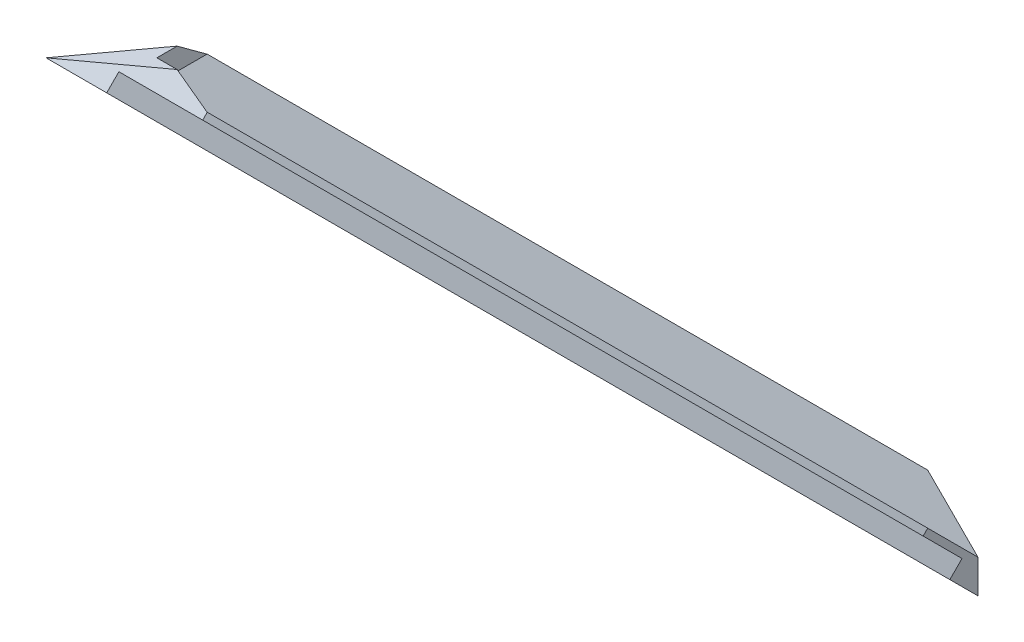
ISO-10303-21;
HEADER;
FILE_DESCRIPTION(('STEP AP214'),'2;1');
FILE_NAME('part.step','',(''),(''),'','','');
FILE_SCHEMA(('AUTOMOTIVE_DESIGN { 1 0 10303 214 1 1 1 1 }'));
ENDSEC;
DATA;
#1=APPLICATION_CONTEXT('core data for automotive mechanical design processes');
#2=APPLICATION_PROTOCOL_DEFINITION('international standard','automotive_design',2000,#1);
#3=PRODUCT_CONTEXT('',#1,'mechanical');
#4=PRODUCT('Part','Part','',(#3));
#5=PRODUCT_RELATED_PRODUCT_CATEGORY('part','',(#4));
#6=PRODUCT_DEFINITION_FORMATION('','',#4);
#7=PRODUCT_DEFINITION_CONTEXT('part definition',#1,'design');
#8=PRODUCT_DEFINITION('design','',#6,#7);
#9=PRODUCT_DEFINITION_SHAPE('','',#8);
#10=(LENGTH_UNIT() NAMED_UNIT(*) SI_UNIT(.MILLI.,.METRE.));
#11=(NAMED_UNIT(*) PLANE_ANGLE_UNIT() SI_UNIT($,.RADIAN.));
#12=(NAMED_UNIT(*) SI_UNIT($,.STERADIAN.) SOLID_ANGLE_UNIT());
#13=UNCERTAINTY_MEASURE_WITH_UNIT(LENGTH_MEASURE(1.E-05),#10,'distance_accuracy_value','');
#14=(GEOMETRIC_REPRESENTATION_CONTEXT(3) GLOBAL_UNCERTAINTY_ASSIGNED_CONTEXT((#13)) GLOBAL_UNIT_ASSIGNED_CONTEXT((#10,
#11,#12)) REPRESENTATION_CONTEXT('',''));
#15=CARTESIAN_POINT('',(0.,0.,0.));
#16=DIRECTION('',(0.,0.,1.));
#17=DIRECTION('',(1.,0.,0.));
#18=AXIS2_PLACEMENT_3D('',#15,#16,#17);
#19=CARTESIAN_POINT('',(-2.22799097931636E-11,6.68963210030669E-12,81.065646874061));
#20=DIRECTION('',(0.,0.,1.));
#21=DIRECTION('',(1.,0.,0.));
#22=AXIS2_PLACEMENT_3D('',#19,#20,#21);
#23=PLANE('',#22);
#24=DIRECTION('',(-0.707106781186531,0.707106781186564,0.));
#25=VECTOR('',#24,1.);
#26=CARTESIAN_POINT('',(-78.9443265304896,-78.9443265304859,81.065646874061));
#27=LINE('',#26,#25);
#28=CARTESIAN_POINT('',(-83.8433060160558,-74.0453470449194,81.0656468740416));
#29=VERTEX_POINT('',#28);
#30=CARTESIAN_POINT('',(-90.6100214304942,-67.2786316304808,81.0656468740416));
#31=VERTEX_POINT('',#30);
#32=EDGE_CURVE('E218',#29,#31,#27,.T.);
#33=ORIENTED_EDGE('',*,*,#32,.T.);
#34=DIRECTION('',(-0.707106781186564,-0.707106781186531,0.));
#35=VECTOR('',#34,1.);
#36=CARTESIAN_POINT('',(-87.2424253850932,-63.9110355850799,81.0656468740418));
#37=LINE('',#36,#35);
#38=CARTESIAN_POINT('',(-89.8162713626101,-66.484881562597,81.0656468740418));
#39=VERTEX_POINT('',#38);
#40=EDGE_CURVE('E209',#39,#31,#37,.T.);
#41=ORIENTED_EDGE('',*,*,#40,.F.);
#42=DIRECTION('',(-0.707106781186548,0.707106781186547,0.));
#43=VECTOR('',#42,1.);
#44=CARTESIAN_POINT('',(-156.301152925207,0.,81.065646874061));
#45=LINE('',#44,#43);
#46=CARTESIAN_POINT('',(-81.065646874061,-75.235506051146,81.065646874061));
#47=VERTEX_POINT('',#46);
#48=EDGE_CURVE('E61',#47,#39,#45,.T.);
#49=ORIENTED_EDGE('',*,*,#48,.F.);
#50=DIRECTION('',(0.,1.,0.));
#51=VECTOR('',#50,1.);
#52=CARTESIAN_POINT('',(-81.0656468740447,7.36469543671736E-12,81.065646874061));
#53=LINE('',#52,#51);
#54=CARTESIAN_POINT('',(-81.0656468740454,-81.0656468740454,81.0656468740454));
#55=VERTEX_POINT('',#54);
#56=EDGE_CURVE('E11',#55,#47,#53,.T.);
#57=ORIENTED_EDGE('',*,*,#56,.F.);
#58=DIRECTION('',(-0.707106781186547,0.707106781186548,0.));
#59=VECTOR('',#58,1.);
#60=CARTESIAN_POINT('',(-162.131293748091,0.,81.065646874061));
#61=LINE('',#60,#59);
#62=CARTESIAN_POINT('',(-85.9646263596136,-76.1666673884772,81.0656468740415));
#63=VERTEX_POINT('',#62);
#64=EDGE_CURVE('E222',#55,#63,#61,.T.);
#65=ORIENTED_EDGE('',*,*,#64,.T.);
#66=DIRECTION('',(-0.707106781186564,-0.707106781186531,0.));
#67=VECTOR('',#66,1.);
#68=CARTESIAN_POINT('',(-83.8433060160558,-74.0453470449194,81.0656468740416));
#69=LINE('',#68,#67);
#70=EDGE_CURVE('E233',#29,#63,#69,.T.);
#71=ORIENTED_EDGE('',*,*,#70,.F.);
#72=EDGE_LOOP('',(#33,#41,#49,#57,#65,#71));
#73=FACE_BOUND('',#72,.T.);
#74=ADVANCED_FACE('F36',(#73),#23,.F.);
#75=CARTESIAN_POINT('',(12.5408992154775,17.1311869146428,17.1311869146428));
#76=DIRECTION('',(-0.459700843380978,-0.627963030199556,-0.627963030199556));
#77=DIRECTION('',(0.,0.707106781186548,-0.707106781186547));
#78=AXIS2_PLACEMENT_3D('',#75,#76,#77);
#79=PLANE('',#78);
#80=DIRECTION('',(0.888073833977118,-0.325057583671865,-0.325057583671865));
#81=VECTOR('',#80,1.);
#82=CARTESIAN_POINT('',(93.606546089524,-93.6065460895218,68.524747658569));
#83=LINE('',#82,#81);
#84=CARTESIAN_POINT('',(-162.131293748091,0.,162.131293748091));
#85=VERTEX_POINT('',#84);
#86=CARTESIAN_POINT('',(-154.403887137778,-2.82842712474623,159.302866623345));
#87=VERTEX_POINT('',#86);
#88=EDGE_CURVE('E242',#85,#87,#83,.T.);
#89=ORIENTED_EDGE('',*,*,#88,.T.);
#90=DIRECTION('',(0.,-0.707106781186547,0.707106781186548));
#91=VECTOR('',#90,1.);
#92=CARTESIAN_POINT('',(-154.403887137778,-0.707106781186718,157.181546279785));
#93=LINE('',#92,#91);
#94=CARTESIAN_POINT('',(-154.403887137778,-0.707106781186718,157.181546279785));
#95=VERTEX_POINT('',#94);
#96=EDGE_CURVE('E142',#95,#87,#93,.T.);
#97=ORIENTED_EDGE('',*,*,#96,.F.);
#98=DIRECTION('',(0.888073833977118,-0.325057583671864,-0.325057583671865));
#99=VECTOR('',#98,1.);
#100=CARTESIAN_POINT('',(12.5408992154776,-61.813139615843,96.0755134451285));
#101=LINE('',#100,#99);
#102=CARTESIAN_POINT('',(-143.730406757284,-4.61387174724231,153.27478131373));
#103=VERTEX_POINT('',#102);
#104=EDGE_CURVE('E137',#95,#103,#101,.T.);
#105=ORIENTED_EDGE('',*,*,#104,.T.);
#106=DIRECTION('',(0.,-0.707106781186547,0.707106781186548));
#107=VECTOR('',#106,1.);
#108=CARTESIAN_POINT('',(-143.730406757284,-1.24627570184138,149.907185268329));
#109=LINE('',#108,#107);
#110=CARTESIAN_POINT('',(-143.730406757284,-3.82012167935991,152.481031245847));
#111=VERTEX_POINT('',#110);
#112=EDGE_CURVE('E141',#111,#103,#109,.T.);
#113=ORIENTED_EDGE('',*,*,#112,.F.);
#114=DIRECTION('',(0.888073833977118,-0.325057583671865,-0.325057583671865));
#115=VECTOR('',#114,1.);
#116=CARTESIAN_POINT('',(90.691475678082,-89.6244858536718,66.6766670715352));
#117=LINE('',#116,#115);
#118=CARTESIAN_POINT('',(-143.758059699553,-3.81000000000011,152.491152925207));
#119=VERTEX_POINT('',#118);
#120=EDGE_CURVE('E152',#119,#111,#117,.T.);
#121=ORIENTED_EDGE('',*,*,#120,.F.);
#122=DIRECTION('',(0.806898221355077,-0.590690494568867,0.));
#123=VECTOR('',#122,1.);
#124=CARTESIAN_POINT('',(-78.5785752817125,-51.5246942050026,152.491152925207));
#125=LINE('',#124,#123);
#126=CARTESIAN_POINT('',(-148.962616487972,0.,152.491152925207));
#127=VERTEX_POINT('',#126);
#128=EDGE_CURVE('E227',#127,#119,#125,.T.);
#129=ORIENTED_EDGE('',*,*,#128,.F.);
#130=DIRECTION('',(-0.806898221355077,0.,0.590690494568867));
#131=VECTOR('',#130,1.);
#132=CARTESIAN_POINT('',(20.7060873158624,0.,28.2850412864472));
#133=LINE('',#132,#131);
#134=EDGE_CURVE('E193',#127,#85,#133,.T.);
#135=ORIENTED_EDGE('',*,*,#134,.T.);
#136=EDGE_LOOP('',(#89,#97,#105,#113,#121,#129,#135));
#137=FACE_BOUND('',#136,.T.);
#138=ADVANCED_FACE('F253',(#137),#79,.F.);
#139=CARTESIAN_POINT('',(-81.0656468740454,6.75063336410865E-13,6.75063336410865E-13));
#140=DIRECTION('',(1.,0.,0.));
#141=DIRECTION('',(0.,1.,0.));
#142=AXIS2_PLACEMENT_3D('',#139,#140,#141);
#143=PLANE('',#142);
#144=DIRECTION('',(0.,0.707106781186548,0.707106781186547));
#145=VECTOR('',#144,1.);
#146=CARTESIAN_POINT('',(-81.065646874044,2.02519000923258E-12,162.131293748093));
#147=LINE('',#146,#145);
#148=CARTESIAN_POINT('',(-81.0656468740452,-76.1666673884791,85.9646263596118));
#149=VERTEX_POINT('',#148);
#150=EDGE_CURVE('E153',#55,#149,#147,.T.);
#151=ORIENTED_EDGE('',*,*,#150,.F.);
#152=ORIENTED_EDGE('',*,*,#56,.T.);
#153=DIRECTION('',(0.,0.707106781186547,0.707106781186548));
#154=VECTOR('',#153,1.);
#155=CARTESIAN_POINT('',(-81.0656468740441,1.97664029098071E-12,156.301152925209));
#156=LINE('',#155,#154);
#157=CARTESIAN_POINT('',(-81.0656468740452,-66.4848815625986,89.8162713626084));
#158=VERTEX_POINT('',#157);
#159=EDGE_CURVE('E166',#47,#158,#156,.T.);
#160=ORIENTED_EDGE('',*,*,#159,.T.);
#161=DIRECTION('',(0.,-0.707106781186547,0.707106781186548));
#162=VECTOR('',#161,1.);
#163=CARTESIAN_POINT('',(-81.0656468740452,-63.9110355850801,87.2424253850899));
#164=LINE('',#163,#162);
#165=CARTESIAN_POINT('',(-81.0656468740452,-67.278631630481,90.6100214304908));
#166=VERTEX_POINT('',#165);
#167=EDGE_CURVE('E151',#158,#166,#164,.T.);
#168=ORIENTED_EDGE('',*,*,#167,.T.);
#169=DIRECTION('',(0.,0.707106781186548,0.707106781186547));
#170=VECTOR('',#169,1.);
#171=CARTESIAN_POINT('',(-81.0656468740454,-78.9443265304851,78.9443265304866));
#172=LINE('',#171,#170);
#173=CARTESIAN_POINT('',(-81.0656468740452,-74.0453470449195,83.8433060160523));
#174=VERTEX_POINT('',#173);
#175=EDGE_CURVE('E134',#174,#166,#172,.T.);
#176=ORIENTED_EDGE('',*,*,#175,.F.);
#177=DIRECTION('',(0.,-0.707106781186547,0.707106781186548));
#178=VECTOR('',#177,1.);
#179=CARTESIAN_POINT('',(-81.0656468740452,-74.0453470449195,83.8433060160523));
#180=LINE('',#179,#178);
#181=EDGE_CURVE('E148',#174,#149,#180,.T.);
#182=ORIENTED_EDGE('',*,*,#181,.T.);
#183=EDGE_LOOP('',(#151,#152,#160,#168,#176,#182));
#184=FACE_BOUND('',#183,.T.);
#185=ADVANCED_FACE('F147',(#184),#143,.T.);
#186=CARTESIAN_POINT('',(0.,0.,0.));
#187=DIRECTION('',(0.,1.,0.));
#188=DIRECTION('',(0.,0.,1.));
#189=AXIS2_PLACEMENT_3D('',#186,#187,#188);
#190=PLANE('',#189);
#191=DIRECTION('',(-1.,0.,0.));
#192=VECTOR('',#191,1.);
#193=CARTESIAN_POINT('',(-152.491152925207,0.,152.491152925207));
#194=LINE('',#193,#192);
#195=CARTESIAN_POINT('',(-152.491152925207,0.,152.491152925207));
#196=VERTEX_POINT('',#195);
#197=EDGE_CURVE('E162',#127,#196,#194,.T.);
#198=ORIENTED_EDGE('',*,*,#197,.T.);
#199=DIRECTION('',(0.,0.,-1.));
#200=VECTOR('',#199,1.);
#201=CARTESIAN_POINT('',(-152.491152925207,0.,-156.301152925207));
#202=LINE('',#201,#200);
#203=CARTESIAN_POINT('',(-152.491152925207,0.,148.962616487966));
#204=VERTEX_POINT('',#203);
#205=EDGE_CURVE('E177',#196,#204,#202,.T.);
#206=ORIENTED_EDGE('',*,*,#205,.T.);
#207=DIRECTION('',(-0.590690494568685,0.,0.80689822135521));
#208=VECTOR('',#207,1.);
#209=CARTESIAN_POINT('',(-28.2850412864929,0.,-20.7060873158861));
#210=LINE('',#209,#208);
#211=EDGE_CURVE('E195',#204,#85,#210,.T.);
#212=ORIENTED_EDGE('',*,*,#211,.T.);
#213=ORIENTED_EDGE('',*,*,#134,.F.);
#214=EDGE_LOOP('',(#198,#206,#212,#213));
#215=FACE_BOUND('',#214,.T.);
#216=ADVANCED_FACE('F273',(#215),#190,.T.);
#217=CARTESIAN_POINT('',(-17.1311869146691,17.1311869146681,-12.5408992154908));
#218=DIRECTION('',(-0.627963030199633,0.627963030199597,-0.459700843380817));
#219=DIRECTION('',(-0.707106781186527,-0.707106781186568,0.));
#220=AXIS2_PLACEMENT_3D('',#217,#218,#219);
#221=PLANE('',#220);
#222=DIRECTION('',(0.325057583671764,-0.325057583671738,-0.888073833977201));
#223=VECTOR('',#222,1.);
#224=CARTESIAN_POINT('',(-96.0755134451512,-61.813139615819,-12.5408992154914));
#225=LINE('',#224,#223);
#226=CARTESIAN_POINT('',(-157.181546279789,-0.707106781186658,154.403887137775));
#227=VERTEX_POINT('',#226);
#228=CARTESIAN_POINT('',(-153.274781313733,-4.61387174724207,143.730406757281));
#229=VERTEX_POINT('',#228);
#230=EDGE_CURVE('E201',#227,#229,#225,.T.);
#231=ORIENTED_EDGE('',*,*,#230,.F.);
#232=DIRECTION('',(-0.707106781186564,-0.707106781186531,0.));
#233=VECTOR('',#232,1.);
#234=CARTESIAN_POINT('',(-157.181546279789,-0.707106781186658,154.403887137775));
#235=LINE('',#234,#233);
#236=CARTESIAN_POINT('',(-159.302866623346,-2.82842712474436,154.403887137775));
#237=VERTEX_POINT('',#236);
#238=EDGE_CURVE('E159',#227,#237,#235,.T.);
#239=ORIENTED_EDGE('',*,*,#238,.T.);
#240=DIRECTION('',(0.325057583671751,-0.325057583671751,-0.888073833977201));
#241=VECTOR('',#240,1.);
#242=CARTESIAN_POINT('',(-162.131293748091,0.,162.131293748091));
#243=LINE('',#242,#241);
#244=EDGE_CURVE('E169',#85,#237,#243,.T.);
#245=ORIENTED_EDGE('',*,*,#244,.F.);
#246=ORIENTED_EDGE('',*,*,#211,.F.);
#247=DIRECTION('',(0.,-0.590690494568707,-0.806898221355194));
#248=VECTOR('',#247,1.);
#249=CARTESIAN_POINT('',(-152.491152925207,-198.70347835943,-122.471382771463));
#250=LINE('',#249,#248);
#251=CARTESIAN_POINT('',(-152.491152925207,-3.80999999999998,143.758059699545));
#252=VERTEX_POINT('',#251);
#253=EDGE_CURVE('E168',#204,#252,#250,.T.);
#254=ORIENTED_EDGE('',*,*,#253,.T.);
#255=DIRECTION('',(0.325057583671751,-0.325057583671751,-0.888073833977201));
#256=VECTOR('',#255,1.);
#257=CARTESIAN_POINT('',(-156.917179787553,0.616026862345548,155.850189963143));
#258=LINE('',#257,#256);
#259=CARTESIAN_POINT('',(-152.481031245849,-3.82012167935813,143.73040675728));
#260=VERTEX_POINT('',#259);
#261=EDGE_CURVE('E178',#252,#260,#258,.T.);
#262=ORIENTED_EDGE('',*,*,#261,.T.);
#263=DIRECTION('',(-0.707106781186564,-0.707106781186531,0.));
#264=VECTOR('',#263,1.);
#265=CARTESIAN_POINT('',(-149.907185268332,-1.24627570184125,143.730406757281));
#266=LINE('',#265,#264);
#267=EDGE_CURVE('E40',#260,#229,#266,.T.);
#268=ORIENTED_EDGE('',*,*,#267,.T.);
#269=EDGE_LOOP('',(#231,#239,#245,#246,#254,#262,#268));
#270=FACE_BOUND('',#269,.T.);
#271=ADVANCED_FACE('F199',(#270),#221,.T.);
#272=CARTESIAN_POINT('',(-162.131293748091,0.,162.131293748091));
#273=DIRECTION('',(-0.707106781186548,-0.707106781186547,0.));
#274=DIRECTION('',(0.,0.,-1.));
#275=AXIS2_PLACEMENT_3D('',#272,#273,#274);
#276=PLANE('',#275);
#277=DIRECTION('',(0.577350269189626,-0.577350269189626,-0.577350269189626));
#278=VECTOR('',#277,1.);
#279=CARTESIAN_POINT('',(-81.0656468740454,-81.0656468740454,81.0656468740454));
#280=LINE('',#279,#278);
#281=EDGE_CURVE('E230',#85,#55,#280,.T.);
#282=ORIENTED_EDGE('',*,*,#281,.F.);
#283=ORIENTED_EDGE('',*,*,#244,.T.);
#284=DIRECTION('',(0.577350269189625,-0.577350269189626,-0.577350269189627));
#285=VECTOR('',#284,1.);
#286=CARTESIAN_POINT('',(-163.764286909948,1.63299316185731,158.865307424376));
#287=LINE('',#286,#285);
#288=EDGE_CURVE('E226',#237,#63,#287,.T.);
#289=ORIENTED_EDGE('',*,*,#288,.T.);
#290=ORIENTED_EDGE('',*,*,#64,.F.);
#291=EDGE_LOOP('',(#282,#283,#289,#290));
#292=FACE_BOUND('',#291,.T.);
#293=ADVANCED_FACE('F276',(#292),#276,.T.);
#294=CARTESIAN_POINT('',(162.131293748091,0.,162.131293748091));
#295=DIRECTION('',(0.,-0.707106781186547,0.707106781186548));
#296=DIRECTION('',(-1.,0.,0.));
#297=AXIS2_PLACEMENT_3D('',#294,#295,#296);
#298=PLANE('',#297);
#299=ORIENTED_EDGE('',*,*,#88,.F.);
#300=ORIENTED_EDGE('',*,*,#281,.T.);
#301=ORIENTED_EDGE('',*,*,#150,.T.);
#302=DIRECTION('',(0.577350269189627,-0.577350269189626,-0.577350269189625));
#303=VECTOR('',#302,1.);
#304=CARTESIAN_POINT('',(-50.7777782589856,-106.454536003538,55.6767577445524));
#305=LINE('',#304,#303);
#306=EDGE_CURVE('E157',#87,#149,#305,.T.);
#307=ORIENTED_EDGE('',*,*,#306,.F.);
#308=EDGE_LOOP('',(#299,#300,#301,#307));
#309=FACE_BOUND('',#308,.T.);
#310=ADVANCED_FACE('F257',(#309),#298,.T.);
#311=CARTESIAN_POINT('',(-154.403887137778,-0.707106781186718,157.181546279785));
#312=DIRECTION('',(-0.816496580927725,-0.408248290463865,-0.408248290463862));
#313=DIRECTION('',(0.44721359549996,-0.894427190999915,0.));
#314=AXIS2_PLACEMENT_3D('',#311,#312,#313);
#315=PLANE('',#314);
#316=ORIENTED_EDGE('',*,*,#306,.T.);
#317=ORIENTED_EDGE('',*,*,#181,.F.);
#318=DIRECTION('',(0.577350269189627,-0.577350269189625,-0.577350269189625));
#319=VECTOR('',#318,1.);
#320=CARTESIAN_POINT('',(-154.403887137778,-0.707106781186718,157.181546279785));
#321=LINE('',#320,#319);
#322=EDGE_CURVE('E130',#95,#174,#321,.T.);
#323=ORIENTED_EDGE('',*,*,#322,.F.);
#324=ORIENTED_EDGE('',*,*,#96,.T.);
#325=EDGE_LOOP('',(#316,#317,#323,#324));
#326=FACE_BOUND('',#325,.T.);
#327=ADVANCED_FACE('F155',(#326),#315,.F.);
#328=CARTESIAN_POINT('',(1.61188097711923E-13,-78.9443265304857,78.9443265304859));
#329=DIRECTION('',(0.,-0.707106781186547,0.707106781186548));
#330=DIRECTION('',(0.,0.707106781186548,0.707106781186547));
#331=AXIS2_PLACEMENT_3D('',#328,#329,#330);
#332=PLANE('',#331);
#333=ORIENTED_EDGE('',*,*,#104,.F.);
#334=ORIENTED_EDGE('',*,*,#322,.T.);
#335=ORIENTED_EDGE('',*,*,#175,.T.);
#336=DIRECTION('',(0.577350269189626,-0.577350269189625,-0.577350269189625));
#337=VECTOR('',#336,1.);
#338=CARTESIAN_POINT('',(-143.730406757284,-4.61387174724231,153.27478131373));
#339=LINE('',#338,#337);
#340=EDGE_CURVE('E235',#103,#166,#339,.T.);
#341=ORIENTED_EDGE('',*,*,#340,.F.);
#342=EDGE_LOOP('',(#333,#334,#335,#341));
#343=FACE_BOUND('',#342,.T.);
#344=ADVANCED_FACE('F132',(#343),#332,.T.);
#345=CARTESIAN_POINT('',(-78.9443265304876,-78.944326530484,-3.71847269865436E-12));
#346=DIRECTION('',(-0.707106781186564,-0.707106781186531,0.));
#347=DIRECTION('',(-0.707106781186531,0.707106781186564,0.));
#348=AXIS2_PLACEMENT_3D('',#345,#346,#347);
#349=PLANE('',#348);
#350=DIRECTION('',(0.577350269189626,-0.577350269189625,-0.577350269189627));
#351=VECTOR('',#350,1.);
#352=CARTESIAN_POINT('',(-157.181546279789,-0.707106781186658,154.403887137775));
#353=LINE('',#352,#351);
#354=EDGE_CURVE('E217',#227,#29,#353,.T.);
#355=ORIENTED_EDGE('',*,*,#354,.F.);
#356=ORIENTED_EDGE('',*,*,#230,.T.);
#357=DIRECTION('',(0.577350269189626,-0.577350269189625,-0.577350269189626));
#358=VECTOR('',#357,1.);
#359=CARTESIAN_POINT('',(-153.274781313733,-4.6138717472421,143.73040675728));
#360=LINE('',#359,#358);
#361=EDGE_CURVE('E208',#229,#31,#360,.T.);
#362=ORIENTED_EDGE('',*,*,#361,.T.);
#363=ORIENTED_EDGE('',*,*,#32,.F.);
#364=EDGE_LOOP('',(#355,#356,#362,#363));
#365=FACE_BOUND('',#364,.T.);
#366=ADVANCED_FACE('F215',(#365),#349,.T.);
#367=CARTESIAN_POINT('',(-143.730406757284,-1.24627570184138,149.907185268329));
#368=DIRECTION('',(-0.816496580927726,-0.408248290463865,-0.408248290463862));
#369=DIRECTION('',(0.447213595499959,-0.894427190999915,0.));
#370=AXIS2_PLACEMENT_3D('',#367,#368,#369);
#371=PLANE('',#370);
#372=ORIENTED_EDGE('',*,*,#167,.F.);
#373=DIRECTION('',(-0.577350269189626,0.577350269189625,0.577350269189626));
#374=VECTOR('',#373,1.);
#375=CARTESIAN_POINT('',(-143.730406757284,-3.82012167935991,152.481031245847));
#376=LINE('',#375,#374);
#377=EDGE_CURVE('E213',#158,#111,#376,.T.);
#378=ORIENTED_EDGE('',*,*,#377,.T.);
#379=ORIENTED_EDGE('',*,*,#112,.T.);
#380=ORIENTED_EDGE('',*,*,#340,.T.);
#381=EDGE_LOOP('',(#372,#378,#379,#380));
#382=FACE_BOUND('',#381,.T.);
#383=ADVANCED_FACE('F268',(#382),#371,.F.);
#384=CARTESIAN_POINT('',(-149.907185268332,-1.24627570184125,143.730406757281));
#385=DIRECTION('',(-0.408248290463835,0.408248290463892,-0.816496580927726));
#386=DIRECTION('',(0.,0.894427190999903,0.447213595499983));
#387=AXIS2_PLACEMENT_3D('',#384,#385,#386);
#388=PLANE('',#387);
#389=DIRECTION('',(-0.577350269189626,0.577350269189626,0.577350269189626));
#390=VECTOR('',#389,1.);
#391=CARTESIAN_POINT('',(-152.481031245849,-3.82012167935813,143.73040675728));
#392=LINE('',#391,#390);
#393=EDGE_CURVE('E206',#39,#260,#392,.T.);
#394=ORIENTED_EDGE('',*,*,#393,.F.);
#395=ORIENTED_EDGE('',*,*,#40,.T.);
#396=ORIENTED_EDGE('',*,*,#361,.F.);
#397=ORIENTED_EDGE('',*,*,#267,.F.);
#398=EDGE_LOOP('',(#394,#395,#396,#397));
#399=FACE_BOUND('',#398,.T.);
#400=ADVANCED_FACE('F205',(#399),#388,.T.);
#401=CARTESIAN_POINT('',(-152.491152925207,-152.491152925207,-156.301152925207));
#402=DIRECTION('',(-1.,0.,0.));
#403=DIRECTION('',(0.,0.,1.));
#404=AXIS2_PLACEMENT_3D('',#401,#402,#403);
#405=PLANE('',#404);
#406=ORIENTED_EDGE('',*,*,#253,.F.);
#407=ORIENTED_EDGE('',*,*,#205,.F.);
#408=DIRECTION('',(0.,1.,0.));
#409=VECTOR('',#408,1.);
#410=CARTESIAN_POINT('',(-152.491152925207,-152.491152925207,152.491152925207));
#411=LINE('',#410,#409);
#412=CARTESIAN_POINT('',(-152.491152925207,-3.81000000000009,152.491152925207));
#413=VERTEX_POINT('',#412);
#414=EDGE_CURVE('E45',#413,#196,#411,.T.);
#415=ORIENTED_EDGE('',*,*,#414,.F.);
#416=DIRECTION('',(0.,0.,-1.));
#417=VECTOR('',#416,1.);
#418=CARTESIAN_POINT('',(-152.491152925207,-3.80999999999998,156.301152925207));
#419=LINE('',#418,#417);
#420=EDGE_CURVE('E173',#413,#252,#419,.T.);
#421=ORIENTED_EDGE('',*,*,#420,.T.);
#422=EDGE_LOOP('',(#406,#407,#415,#421));
#423=FACE_BOUND('',#422,.T.);
#424=ADVANCED_FACE('F272',(#423),#405,.F.);
#425=CARTESIAN_POINT('',(156.301152925207,0.,156.301152925207));
#426=DIRECTION('',(0.,-0.707106781186548,0.707106781186547));
#427=DIRECTION('',(-1.,0.,0.));
#428=AXIS2_PLACEMENT_3D('',#425,#426,#427);
#429=PLANE('',#428);
#430=DIRECTION('',(-1.,0.,0.));
#431=VECTOR('',#430,1.);
#432=CARTESIAN_POINT('',(156.301152925207,-3.81000000000012,152.491152925207));
#433=LINE('',#432,#431);
#434=EDGE_CURVE('E53',#119,#413,#433,.T.);
#435=ORIENTED_EDGE('',*,*,#434,.F.);
#436=ORIENTED_EDGE('',*,*,#120,.T.);
#437=ORIENTED_EDGE('',*,*,#377,.F.);
#438=ORIENTED_EDGE('',*,*,#159,.F.);
#439=DIRECTION('',(0.577350269189626,-0.577350269189626,-0.577350269189626));
#440=VECTOR('',#439,1.);
#441=CARTESIAN_POINT('',(-78.1505764626035,-78.1505764626035,78.1505764626035));
#442=LINE('',#441,#440);
#443=EDGE_CURVE('E172',#413,#47,#442,.T.);
#444=ORIENTED_EDGE('',*,*,#443,.F.);
#445=EDGE_LOOP('',(#435,#436,#437,#438,#444));
#446=FACE_BOUND('',#445,.T.);
#447=ADVANCED_FACE('F264',(#446),#429,.F.);
#448=CARTESIAN_POINT('',(-152.491152925207,-152.491152925207,152.491152925207));
#449=DIRECTION('',(0.,0.,1.));
#450=DIRECTION('',(1.,0.,0.));
#451=AXIS2_PLACEMENT_3D('',#448,#449,#450);
#452=PLANE('',#451);
#453=ORIENTED_EDGE('',*,*,#197,.F.);
#454=ORIENTED_EDGE('',*,*,#128,.T.);
#455=ORIENTED_EDGE('',*,*,#434,.T.);
#456=ORIENTED_EDGE('',*,*,#414,.T.);
#457=EDGE_LOOP('',(#453,#454,#455,#456));
#458=FACE_BOUND('',#457,.T.);
#459=ADVANCED_FACE('F269',(#458),#452,.F.);
#460=CARTESIAN_POINT('',(-156.301152925207,0.,156.301152925207));
#461=DIRECTION('',(-0.707106781186547,-0.707106781186548,0.));
#462=DIRECTION('',(0.,0.,-1.));
#463=AXIS2_PLACEMENT_3D('',#460,#461,#462);
#464=PLANE('',#463);
#465=ORIENTED_EDGE('',*,*,#261,.F.);
#466=ORIENTED_EDGE('',*,*,#420,.F.);
#467=ORIENTED_EDGE('',*,*,#443,.T.);
#468=ORIENTED_EDGE('',*,*,#48,.T.);
#469=ORIENTED_EDGE('',*,*,#393,.T.);
#470=EDGE_LOOP('',(#465,#466,#467,#468,#469));
#471=FACE_BOUND('',#470,.T.);
#472=ADVANCED_FACE('F38',(#471),#464,.F.);
#473=CARTESIAN_POINT('',(-157.181546279789,-0.707106781186658,154.403887137775));
#474=DIRECTION('',(-0.408248290463835,0.408248290463892,-0.816496580927725));
#475=DIRECTION('',(0.,0.894427190999903,0.447213595499984));
#476=AXIS2_PLACEMENT_3D('',#473,#474,#475);
#477=PLANE('',#476);
#478=ORIENTED_EDGE('',*,*,#238,.F.);
#479=ORIENTED_EDGE('',*,*,#354,.T.);
#480=ORIENTED_EDGE('',*,*,#70,.T.);
#481=ORIENTED_EDGE('',*,*,#288,.F.);
#482=EDGE_LOOP('',(#478,#479,#480,#481));
#483=FACE_BOUND('',#482,.T.);
#484=ADVANCED_FACE('F278',(#483),#477,.T.);
#485=CLOSED_SHELL('',(#74,#138,#185,#216,#271,#293,#310,#327,#344,#366,#383,#400,#424,#447,#459,
#472,#484));
#486=MANIFOLD_SOLID_BREP('B2',#485);
#487=ADVANCED_BREP_SHAPE_REPRESENTATION('',(#18,#486),#14);
#488=SHAPE_DEFINITION_REPRESENTATION(#9,#487);
ENDSEC;
END-ISO-10303-21;
